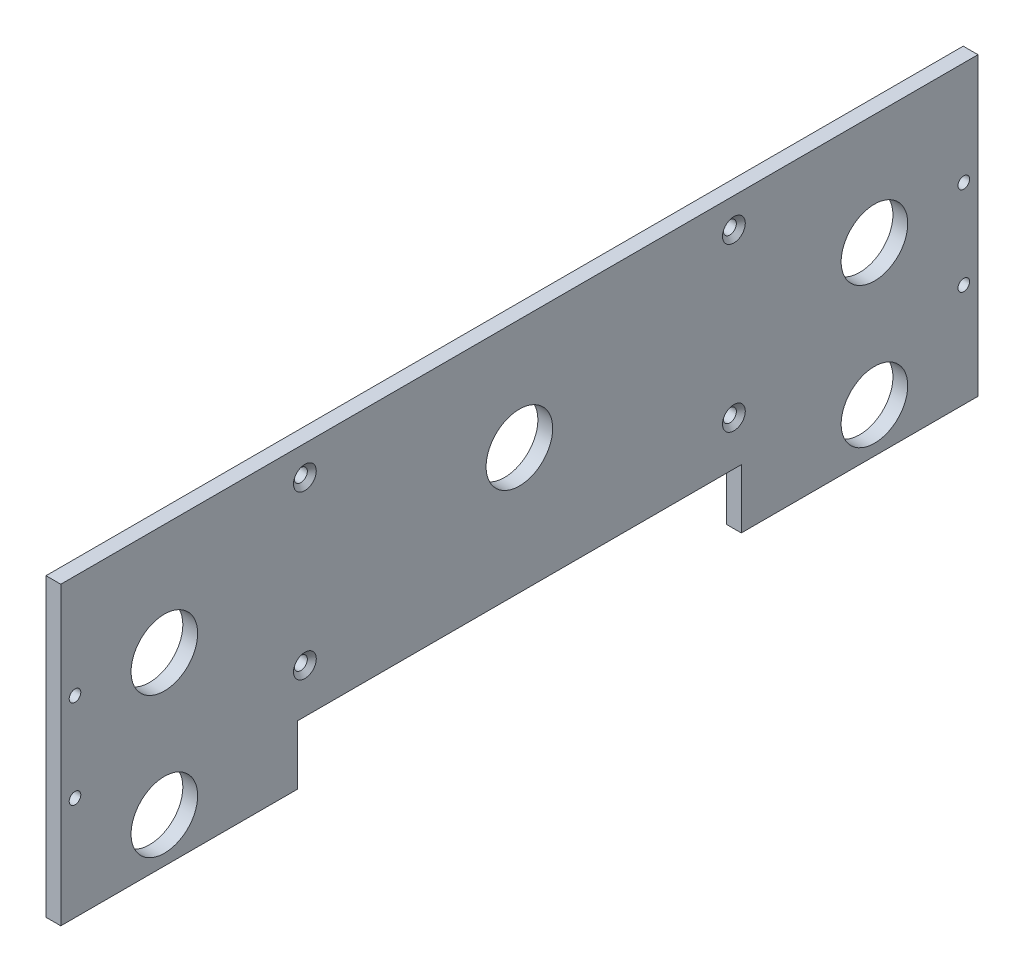
ISO-10303-21;
HEADER;
FILE_DESCRIPTION(('STEP AP214'),'2;1');
FILE_NAME('part.step','',(''),(''),'','','');
FILE_SCHEMA(('AUTOMOTIVE_DESIGN { 1 0 10303 214 1 1 1 1 }'));
ENDSEC;
DATA;
#1=APPLICATION_CONTEXT('core data for automotive mechanical design processes');
#2=APPLICATION_PROTOCOL_DEFINITION('international standard','automotive_design',2000,#1);
#3=PRODUCT_CONTEXT('',#1,'mechanical');
#4=PRODUCT('Part','Part','',(#3));
#5=PRODUCT_RELATED_PRODUCT_CATEGORY('part','',(#4));
#6=PRODUCT_DEFINITION_FORMATION('','',#4);
#7=PRODUCT_DEFINITION_CONTEXT('part definition',#1,'design');
#8=PRODUCT_DEFINITION('design','',#6,#7);
#9=PRODUCT_DEFINITION_SHAPE('','',#8);
#10=(LENGTH_UNIT() NAMED_UNIT(*) SI_UNIT(.MILLI.,.METRE.));
#11=(NAMED_UNIT(*) PLANE_ANGLE_UNIT() SI_UNIT($,.RADIAN.));
#12=(NAMED_UNIT(*) SI_UNIT($,.STERADIAN.) SOLID_ANGLE_UNIT());
#13=UNCERTAINTY_MEASURE_WITH_UNIT(LENGTH_MEASURE(1.E-05),#10,'distance_accuracy_value','');
#14=(GEOMETRIC_REPRESENTATION_CONTEXT(3) GLOBAL_UNCERTAINTY_ASSIGNED_CONTEXT((#13)) GLOBAL_UNIT_ASSIGNED_CONTEXT((#10,
#11,#12)) REPRESENTATION_CONTEXT('',''));
#15=CARTESIAN_POINT('',(0.,0.,0.));
#16=DIRECTION('',(0.,0.,1.));
#17=DIRECTION('',(1.,0.,0.));
#18=AXIS2_PLACEMENT_3D('',#15,#16,#17);
#19=CARTESIAN_POINT('',(6.35,-63.5,196.85));
#20=DIRECTION('',(0.,1.,0.));
#21=DIRECTION('',(0.,0.,1.));
#22=AXIS2_PLACEMENT_3D('',#19,#20,#21);
#23=PLANE('',#22);
#24=DIRECTION('',(0.,0.,-1.));
#25=VECTOR('',#24,1.);
#26=CARTESIAN_POINT('',(0.,-63.5,196.85));
#27=LINE('',#26,#25);
#28=CARTESIAN_POINT('',(0.,-63.5,196.85));
#29=VERTEX_POINT('',#28);
#30=CARTESIAN_POINT('',(0.,-63.5,95.25));
#31=VERTEX_POINT('',#30);
#32=EDGE_CURVE('E128',#29,#31,#27,.T.);
#33=ORIENTED_EDGE('',*,*,#32,.T.);
#34=DIRECTION('',(1.,0.,0.));
#35=VECTOR('',#34,1.);
#36=CARTESIAN_POINT('',(0.,-63.5,95.25));
#37=LINE('',#36,#35);
#38=CARTESIAN_POINT('',(6.35,-63.5,95.25));
#39=VERTEX_POINT('',#38);
#40=EDGE_CURVE('E155',#31,#39,#37,.T.);
#41=ORIENTED_EDGE('',*,*,#40,.T.);
#42=DIRECTION('',(0.,0.,-1.));
#43=VECTOR('',#42,1.);
#44=CARTESIAN_POINT('',(6.35,-63.5,196.85));
#45=LINE('',#44,#43);
#46=CARTESIAN_POINT('',(6.35,-63.5,196.85));
#47=VERTEX_POINT('',#46);
#48=EDGE_CURVE('E140',#47,#39,#45,.T.);
#49=ORIENTED_EDGE('',*,*,#48,.F.);
#50=DIRECTION('',(-1.,0.,0.));
#51=VECTOR('',#50,1.);
#52=CARTESIAN_POINT('',(6.35,-63.5,196.85));
#53=LINE('',#52,#51);
#54=EDGE_CURVE('E139',#47,#29,#53,.T.);
#55=ORIENTED_EDGE('',*,*,#54,.T.);
#56=EDGE_LOOP('',(#33,#41,#49,#55));
#57=FACE_BOUND('',#56,.T.);
#58=ADVANCED_FACE('F39',(#57),#23,.F.);
#59=CARTESIAN_POINT('',(6.35,63.5,-196.85));
#60=DIRECTION('',(0.,0.,1.));
#61=DIRECTION('',(1.,0.,0.));
#62=AXIS2_PLACEMENT_3D('',#59,#60,#61);
#63=PLANE('',#62);
#64=DIRECTION('',(0.,1.,0.));
#65=VECTOR('',#64,1.);
#66=CARTESIAN_POINT('',(0.,63.5,-196.85));
#67=LINE('',#66,#65);
#68=CARTESIAN_POINT('',(0.,-63.5,-196.85));
#69=VERTEX_POINT('',#68);
#70=CARTESIAN_POINT('',(0.,63.5,-196.85));
#71=VERTEX_POINT('',#70);
#72=EDGE_CURVE('E127',#69,#71,#67,.T.);
#73=ORIENTED_EDGE('',*,*,#72,.T.);
#74=DIRECTION('',(-1.,0.,0.));
#75=VECTOR('',#74,1.);
#76=CARTESIAN_POINT('',(6.35,63.5,-196.85));
#77=LINE('',#76,#75);
#78=CARTESIAN_POINT('',(6.35,63.5,-196.85));
#79=VERTEX_POINT('',#78);
#80=EDGE_CURVE('E11',#79,#71,#77,.T.);
#81=ORIENTED_EDGE('',*,*,#80,.F.);
#82=DIRECTION('',(0.,1.,0.));
#83=VECTOR('',#82,1.);
#84=CARTESIAN_POINT('',(6.35,63.5,-196.85));
#85=LINE('',#84,#83);
#86=CARTESIAN_POINT('',(6.35,-63.5,-196.85));
#87=VERTEX_POINT('',#86);
#88=EDGE_CURVE('E132',#87,#79,#85,.T.);
#89=ORIENTED_EDGE('',*,*,#88,.F.);
#90=DIRECTION('',(-1.,0.,0.));
#91=VECTOR('',#90,1.);
#92=CARTESIAN_POINT('',(6.35,-63.5,-196.85));
#93=LINE('',#92,#91);
#94=EDGE_CURVE('E137',#87,#69,#93,.T.);
#95=ORIENTED_EDGE('',*,*,#94,.T.);
#96=EDGE_LOOP('',(#73,#81,#89,#95));
#97=FACE_BOUND('',#96,.T.);
#98=ADVANCED_FACE('F41',(#97),#63,.F.);
#99=CARTESIAN_POINT('',(6.35,63.5,196.85));
#100=DIRECTION('',(0.,-1.,0.));
#101=DIRECTION('',(0.,0.,-1.));
#102=AXIS2_PLACEMENT_3D('',#99,#100,#101);
#103=PLANE('',#102);
#104=DIRECTION('',(0.,0.,1.));
#105=VECTOR('',#104,1.);
#106=CARTESIAN_POINT('',(0.,63.5,196.85));
#107=LINE('',#106,#105);
#108=CARTESIAN_POINT('',(0.,63.5,196.85));
#109=VERTEX_POINT('',#108);
#110=EDGE_CURVE('E133',#71,#109,#107,.T.);
#111=ORIENTED_EDGE('',*,*,#110,.T.);
#112=DIRECTION('',(-1.,0.,0.));
#113=VECTOR('',#112,1.);
#114=CARTESIAN_POINT('',(6.35,63.5,196.85));
#115=LINE('',#114,#113);
#116=CARTESIAN_POINT('',(6.35,63.5,196.85));
#117=VERTEX_POINT('',#116);
#118=EDGE_CURVE('E47',#117,#109,#115,.T.);
#119=ORIENTED_EDGE('',*,*,#118,.F.);
#120=DIRECTION('',(0.,0.,1.));
#121=VECTOR('',#120,1.);
#122=CARTESIAN_POINT('',(6.35,63.5,196.85));
#123=LINE('',#122,#121);
#124=EDGE_CURVE('E92',#79,#117,#123,.T.);
#125=ORIENTED_EDGE('',*,*,#124,.F.);
#126=ORIENTED_EDGE('',*,*,#80,.T.);
#127=EDGE_LOOP('',(#111,#119,#125,#126));
#128=FACE_BOUND('',#127,.T.);
#129=ADVANCED_FACE('F163',(#128),#103,.F.);
#130=CARTESIAN_POINT('',(6.35,63.5,196.85));
#131=DIRECTION('',(0.,0.,-1.));
#132=DIRECTION('',(-1.,0.,0.));
#133=AXIS2_PLACEMENT_3D('',#130,#131,#132);
#134=PLANE('',#133);
#135=DIRECTION('',(0.,-1.,0.));
#136=VECTOR('',#135,1.);
#137=CARTESIAN_POINT('',(0.,63.5,196.85));
#138=LINE('',#137,#136);
#139=EDGE_CURVE('E129',#109,#29,#138,.T.);
#140=ORIENTED_EDGE('',*,*,#139,.T.);
#141=ORIENTED_EDGE('',*,*,#54,.F.);
#142=DIRECTION('',(0.,-1.,0.));
#143=VECTOR('',#142,1.);
#144=CARTESIAN_POINT('',(6.35,63.5,196.85));
#145=LINE('',#144,#143);
#146=EDGE_CURVE('E148',#117,#47,#145,.T.);
#147=ORIENTED_EDGE('',*,*,#146,.F.);
#148=ORIENTED_EDGE('',*,*,#118,.T.);
#149=EDGE_LOOP('',(#140,#141,#147,#148));
#150=FACE_BOUND('',#149,.T.);
#151=ADVANCED_FACE('F146',(#150),#134,.F.);
#152=CARTESIAN_POINT('',(6.35,-63.5,-95.25));
#153=VERTEX_POINT('',#152);
#154=EDGE_CURVE('E63',#153,#87,#45,.T.);
#155=ORIENTED_EDGE('',*,*,#154,.F.);
#156=DIRECTION('',(1.,0.,0.));
#157=VECTOR('',#156,1.);
#158=CARTESIAN_POINT('',(0.,-63.5,-95.25));
#159=LINE('',#158,#157);
#160=CARTESIAN_POINT('',(0.,-63.5,-95.25));
#161=VERTEX_POINT('',#160);
#162=EDGE_CURVE('E116',#161,#153,#159,.T.);
#163=ORIENTED_EDGE('',*,*,#162,.F.);
#164=EDGE_CURVE('E85',#161,#69,#27,.T.);
#165=ORIENTED_EDGE('',*,*,#164,.T.);
#166=ORIENTED_EDGE('',*,*,#94,.F.);
#167=EDGE_LOOP('',(#155,#163,#165,#166));
#168=FACE_BOUND('',#167,.T.);
#169=ADVANCED_FACE('F121',(#168),#23,.F.);
#170=CARTESIAN_POINT('',(6.35,0.,0.));
#171=DIRECTION('',(1.,0.,0.));
#172=DIRECTION('',(0.,0.,-1.));
#173=AXIS2_PLACEMENT_3D('',#170,#171,#172);
#174=PLANE('',#173);
#175=DIRECTION('',(0.,-1.,0.));
#176=VECTOR('',#175,1.);
#177=CARTESIAN_POINT('',(6.35,-63.5,95.25));
#178=LINE('',#177,#176);
#179=CARTESIAN_POINT('',(6.35,-38.1,95.25));
#180=VERTEX_POINT('',#179);
#181=EDGE_CURVE('E119',#180,#39,#178,.T.);
#182=ORIENTED_EDGE('',*,*,#181,.F.);
#183=DIRECTION('',(0.,0.,1.));
#184=VECTOR('',#183,1.);
#185=CARTESIAN_POINT('',(6.35,-38.1,95.25));
#186=LINE('',#185,#184);
#187=CARTESIAN_POINT('',(6.35,-38.1,-95.25));
#188=VERTEX_POINT('',#187);
#189=EDGE_CURVE('E263',#188,#180,#186,.T.);
#190=ORIENTED_EDGE('',*,*,#189,.F.);
#191=DIRECTION('',(0.,1.,0.));
#192=VECTOR('',#191,1.);
#193=CARTESIAN_POINT('',(6.35,-38.1,-95.25));
#194=LINE('',#193,#192);
#195=EDGE_CURVE('E266',#153,#188,#194,.T.);
#196=ORIENTED_EDGE('',*,*,#195,.F.);
#197=ORIENTED_EDGE('',*,*,#154,.T.);
#198=ORIENTED_EDGE('',*,*,#88,.T.);
#199=ORIENTED_EDGE('',*,*,#124,.T.);
#200=ORIENTED_EDGE('',*,*,#146,.T.);
#201=ORIENTED_EDGE('',*,*,#48,.T.);
#202=EDGE_LOOP('',(#182,#190,#196,#197,#198,#199,#200,#201));
#203=FACE_BOUND('',#202,.T.);
#204=CARTESIAN_POINT('',(6.35,50.8,92.075));
#205=DIRECTION('',(1.,0.,0.));
#206=DIRECTION('',(0.,0.,-1.));
#207=AXIS2_PLACEMENT_3D('',#204,#205,#206);
#208=CIRCLE('',#207,4.8895);
#209=CARTESIAN_POINT('',(6.35,50.8,87.1855));
#210=VERTEX_POINT('',#209);
#211=EDGE_CURVE('E255',#210,#210,#208,.T.);
#212=ORIENTED_EDGE('',*,*,#211,.F.);
#213=EDGE_LOOP('',(#212));
#214=FACE_BOUND('',#213,.T.);
#215=CARTESIAN_POINT('',(6.35,50.8,-92.075));
#216=DIRECTION('',(1.,0.,0.));
#217=DIRECTION('',(0.,0.,-1.));
#218=AXIS2_PLACEMENT_3D('',#215,#216,#217);
#219=CIRCLE('',#218,4.8895);
#220=CARTESIAN_POINT('',(6.35,50.8,-96.9645));
#221=VERTEX_POINT('',#220);
#222=EDGE_CURVE('E246',#221,#221,#219,.T.);
#223=ORIENTED_EDGE('',*,*,#222,.F.);
#224=EDGE_LOOP('',(#223));
#225=FACE_BOUND('',#224,.T.);
#226=CARTESIAN_POINT('',(6.35,-19.05,92.075));
#227=DIRECTION('',(1.,0.,0.));
#228=DIRECTION('',(0.,0.,-1.));
#229=AXIS2_PLACEMENT_3D('',#226,#227,#228);
#230=CIRCLE('',#229,4.8895);
#231=CARTESIAN_POINT('',(6.35,-19.05,87.1855));
#232=VERTEX_POINT('',#231);
#233=EDGE_CURVE('E237',#232,#232,#230,.T.);
#234=ORIENTED_EDGE('',*,*,#233,.F.);
#235=EDGE_LOOP('',(#234));
#236=FACE_BOUND('',#235,.T.);
#237=CARTESIAN_POINT('',(6.35,-19.05,-92.075));
#238=DIRECTION('',(1.,0.,0.));
#239=DIRECTION('',(0.,0.,-1.));
#240=AXIS2_PLACEMENT_3D('',#237,#238,#239);
#241=CIRCLE('',#240,4.8895);
#242=CARTESIAN_POINT('',(6.35,-19.05,-96.9645));
#243=VERTEX_POINT('',#242);
#244=EDGE_CURVE('E228',#243,#243,#241,.T.);
#245=ORIENTED_EDGE('',*,*,#244,.F.);
#246=EDGE_LOOP('',(#245));
#247=FACE_BOUND('',#246,.T.);
#248=CARTESIAN_POINT('',(6.35,19.05,190.754));
#249=DIRECTION('',(1.,0.,0.));
#250=DIRECTION('',(0.,0.,-1.));
#251=AXIS2_PLACEMENT_3D('',#248,#249,#250);
#252=CIRCLE('',#251,2.4892);
#253=CARTESIAN_POINT('',(6.35,19.05,188.2648));
#254=VERTEX_POINT('',#253);
#255=EDGE_CURVE('E219',#254,#254,#252,.T.);
#256=ORIENTED_EDGE('',*,*,#255,.F.);
#257=EDGE_LOOP('',(#256));
#258=FACE_BOUND('',#257,.T.);
#259=CARTESIAN_POINT('',(6.35,-19.05,190.754));
#260=DIRECTION('',(1.,0.,0.));
#261=DIRECTION('',(0.,0.,-1.));
#262=AXIS2_PLACEMENT_3D('',#259,#260,#261);
#263=CIRCLE('',#262,2.4892);
#264=CARTESIAN_POINT('',(6.35,-19.05,188.2648));
#265=VERTEX_POINT('',#264);
#266=EDGE_CURVE('E213',#265,#265,#263,.T.);
#267=ORIENTED_EDGE('',*,*,#266,.F.);
#268=EDGE_LOOP('',(#267));
#269=FACE_BOUND('',#268,.T.);
#270=CARTESIAN_POINT('',(6.35,19.05,-190.754));
#271=DIRECTION('',(1.,0.,0.));
#272=DIRECTION('',(0.,0.,-1.));
#273=AXIS2_PLACEMENT_3D('',#270,#271,#272);
#274=CIRCLE('',#273,2.4892);
#275=CARTESIAN_POINT('',(6.35,19.05,-193.2432));
#276=VERTEX_POINT('',#275);
#277=EDGE_CURVE('E207',#276,#276,#274,.T.);
#278=ORIENTED_EDGE('',*,*,#277,.F.);
#279=EDGE_LOOP('',(#278));
#280=FACE_BOUND('',#279,.T.);
#281=CARTESIAN_POINT('',(6.35,-19.05,-190.754));
#282=DIRECTION('',(1.,0.,0.));
#283=DIRECTION('',(0.,0.,-1.));
#284=AXIS2_PLACEMENT_3D('',#281,#282,#283);
#285=CIRCLE('',#284,2.4892);
#286=CARTESIAN_POINT('',(6.35,-19.05,-193.2432));
#287=VERTEX_POINT('',#286);
#288=EDGE_CURVE('E201',#287,#287,#285,.T.);
#289=ORIENTED_EDGE('',*,*,#288,.F.);
#290=EDGE_LOOP('',(#289));
#291=FACE_BOUND('',#290,.T.);
#292=CARTESIAN_POINT('',(6.35,-44.45,-152.4));
#293=DIRECTION('',(1.,0.,0.));
#294=DIRECTION('',(0.,0.,-1.));
#295=AXIS2_PLACEMENT_3D('',#292,#293,#294);
#296=CIRCLE('',#295,14.2875);
#297=CARTESIAN_POINT('',(6.35,-44.45,-166.6875));
#298=VERTEX_POINT('',#297);
#299=EDGE_CURVE('E178',#298,#298,#296,.T.);
#300=ORIENTED_EDGE('',*,*,#299,.F.);
#301=EDGE_LOOP('',(#300));
#302=FACE_BOUND('',#301,.T.);
#303=CARTESIAN_POINT('',(6.35,-44.45,152.4));
#304=DIRECTION('',(1.,0.,0.));
#305=DIRECTION('',(0.,0.,-1.));
#306=AXIS2_PLACEMENT_3D('',#303,#304,#305);
#307=CIRCLE('',#306,14.2875);
#308=CARTESIAN_POINT('',(6.35,-44.45,138.1125));
#309=VERTEX_POINT('',#308);
#310=EDGE_CURVE('E185',#309,#309,#307,.T.);
#311=ORIENTED_EDGE('',*,*,#310,.F.);
#312=EDGE_LOOP('',(#311));
#313=FACE_BOUND('',#312,.T.);
#314=CARTESIAN_POINT('',(6.35,15.875,-152.4));
#315=DIRECTION('',(1.,0.,0.));
#316=DIRECTION('',(0.,0.,-1.));
#317=AXIS2_PLACEMENT_3D('',#314,#315,#316);
#318=CIRCLE('',#317,14.2875);
#319=CARTESIAN_POINT('',(6.35,15.875,-166.6875));
#320=VERTEX_POINT('',#319);
#321=EDGE_CURVE('E191',#320,#320,#318,.T.);
#322=ORIENTED_EDGE('',*,*,#321,.F.);
#323=EDGE_LOOP('',(#322));
#324=FACE_BOUND('',#323,.T.);
#325=CARTESIAN_POINT('',(6.35,15.875,152.4));
#326=DIRECTION('',(1.,0.,0.));
#327=DIRECTION('',(0.,0.,-1.));
#328=AXIS2_PLACEMENT_3D('',#325,#326,#327);
#329=CIRCLE('',#328,14.2875);
#330=CARTESIAN_POINT('',(6.35,15.875,138.1125));
#331=VERTEX_POINT('',#330);
#332=EDGE_CURVE('E172',#331,#331,#329,.T.);
#333=ORIENTED_EDGE('',*,*,#332,.F.);
#334=EDGE_LOOP('',(#333));
#335=FACE_BOUND('',#334,.T.);
#336=CARTESIAN_POINT('',(6.35,15.875,0.));
#337=DIRECTION('',(1.,0.,0.));
#338=DIRECTION('',(0.,0.,-1.));
#339=AXIS2_PLACEMENT_3D('',#336,#337,#338);
#340=CIRCLE('',#339,14.2875);
#341=CARTESIAN_POINT('',(6.35,15.875,-14.2875));
#342=VERTEX_POINT('',#341);
#343=EDGE_CURVE('E169',#342,#342,#340,.T.);
#344=ORIENTED_EDGE('',*,*,#343,.F.);
#345=EDGE_LOOP('',(#344));
#346=FACE_BOUND('',#345,.T.);
#347=ADVANCED_FACE('F270',(#203,#214,#225,#236,#247,#258,#269,#280,#291,#302,#313,#324,#335,
#346),#174,.T.);
#348=CARTESIAN_POINT('',(0.,0.,0.));
#349=DIRECTION('',(1.,0.,0.));
#350=DIRECTION('',(0.,0.,-1.));
#351=AXIS2_PLACEMENT_3D('',#348,#349,#350);
#352=PLANE('',#351);
#353=CARTESIAN_POINT('',(0.,50.8,92.075));
#354=DIRECTION('',(1.,0.,0.));
#355=DIRECTION('',(0.,0.,-1.));
#356=AXIS2_PLACEMENT_3D('',#353,#354,#355);
#357=CIRCLE('',#356,2.8067);
#358=CARTESIAN_POINT('',(0.,50.8,89.2683));
#359=VERTEX_POINT('',#358);
#360=EDGE_CURVE('E249',#359,#359,#357,.T.);
#361=ORIENTED_EDGE('',*,*,#360,.T.);
#362=EDGE_LOOP('',(#361));
#363=FACE_BOUND('',#362,.T.);
#364=CARTESIAN_POINT('',(0.,50.8,-92.075));
#365=DIRECTION('',(1.,0.,0.));
#366=DIRECTION('',(0.,0.,-1.));
#367=AXIS2_PLACEMENT_3D('',#364,#365,#366);
#368=CIRCLE('',#367,2.8067);
#369=CARTESIAN_POINT('',(0.,50.8,-94.8817));
#370=VERTEX_POINT('',#369);
#371=EDGE_CURVE('E240',#370,#370,#368,.T.);
#372=ORIENTED_EDGE('',*,*,#371,.T.);
#373=EDGE_LOOP('',(#372));
#374=FACE_BOUND('',#373,.T.);
#375=CARTESIAN_POINT('',(0.,-19.05,92.075));
#376=DIRECTION('',(1.,0.,0.));
#377=DIRECTION('',(0.,0.,-1.));
#378=AXIS2_PLACEMENT_3D('',#375,#376,#377);
#379=CIRCLE('',#378,2.8067);
#380=CARTESIAN_POINT('',(0.,-19.05,89.2683));
#381=VERTEX_POINT('',#380);
#382=EDGE_CURVE('E231',#381,#381,#379,.T.);
#383=ORIENTED_EDGE('',*,*,#382,.T.);
#384=EDGE_LOOP('',(#383));
#385=FACE_BOUND('',#384,.T.);
#386=CARTESIAN_POINT('',(0.,-19.05,-92.075));
#387=DIRECTION('',(1.,0.,0.));
#388=DIRECTION('',(0.,0.,-1.));
#389=AXIS2_PLACEMENT_3D('',#386,#387,#388);
#390=CIRCLE('',#389,2.8067);
#391=CARTESIAN_POINT('',(0.,-19.05,-94.8817));
#392=VERTEX_POINT('',#391);
#393=EDGE_CURVE('E222',#392,#392,#390,.T.);
#394=ORIENTED_EDGE('',*,*,#393,.T.);
#395=EDGE_LOOP('',(#394));
#396=FACE_BOUND('',#395,.T.);
#397=CARTESIAN_POINT('',(0.,19.05,190.754));
#398=DIRECTION('',(1.,0.,0.));
#399=DIRECTION('',(0.,0.,-1.));
#400=AXIS2_PLACEMENT_3D('',#397,#398,#399);
#401=CIRCLE('',#400,2.4892);
#402=CARTESIAN_POINT('',(0.,19.05,188.2648));
#403=VERTEX_POINT('',#402);
#404=EDGE_CURVE('E216',#403,#403,#401,.T.);
#405=ORIENTED_EDGE('',*,*,#404,.T.);
#406=EDGE_LOOP('',(#405));
#407=FACE_BOUND('',#406,.T.);
#408=CARTESIAN_POINT('',(0.,-19.05,190.754));
#409=DIRECTION('',(1.,0.,0.));
#410=DIRECTION('',(0.,0.,-1.));
#411=AXIS2_PLACEMENT_3D('',#408,#409,#410);
#412=CIRCLE('',#411,2.4892);
#413=CARTESIAN_POINT('',(0.,-19.05,188.2648));
#414=VERTEX_POINT('',#413);
#415=EDGE_CURVE('E210',#414,#414,#412,.T.);
#416=ORIENTED_EDGE('',*,*,#415,.T.);
#417=EDGE_LOOP('',(#416));
#418=FACE_BOUND('',#417,.T.);
#419=CARTESIAN_POINT('',(0.,19.05,-190.754));
#420=DIRECTION('',(1.,0.,0.));
#421=DIRECTION('',(0.,0.,-1.));
#422=AXIS2_PLACEMENT_3D('',#419,#420,#421);
#423=CIRCLE('',#422,2.4892);
#424=CARTESIAN_POINT('',(0.,19.05,-193.2432));
#425=VERTEX_POINT('',#424);
#426=EDGE_CURVE('E204',#425,#425,#423,.T.);
#427=ORIENTED_EDGE('',*,*,#426,.T.);
#428=EDGE_LOOP('',(#427));
#429=FACE_BOUND('',#428,.T.);
#430=CARTESIAN_POINT('',(0.,-19.05,-190.754));
#431=DIRECTION('',(1.,0.,0.));
#432=DIRECTION('',(0.,0.,-1.));
#433=AXIS2_PLACEMENT_3D('',#430,#431,#432);
#434=CIRCLE('',#433,2.4892);
#435=CARTESIAN_POINT('',(0.,-19.05,-193.2432));
#436=VERTEX_POINT('',#435);
#437=EDGE_CURVE('E179',#436,#436,#434,.T.);
#438=ORIENTED_EDGE('',*,*,#437,.T.);
#439=EDGE_LOOP('',(#438));
#440=FACE_BOUND('',#439,.T.);
#441=CARTESIAN_POINT('',(0.,-44.45,-152.4));
#442=DIRECTION('',(1.,0.,0.));
#443=DIRECTION('',(0.,0.,-1.));
#444=AXIS2_PLACEMENT_3D('',#441,#442,#443);
#445=CIRCLE('',#444,14.2875);
#446=CARTESIAN_POINT('',(0.,-44.45,-166.6875));
#447=VERTEX_POINT('',#446);
#448=EDGE_CURVE('E175',#447,#447,#445,.T.);
#449=ORIENTED_EDGE('',*,*,#448,.T.);
#450=EDGE_LOOP('',(#449));
#451=FACE_BOUND('',#450,.T.);
#452=CARTESIAN_POINT('',(0.,-44.45,152.4));
#453=DIRECTION('',(1.,0.,0.));
#454=DIRECTION('',(0.,0.,-1.));
#455=AXIS2_PLACEMENT_3D('',#452,#453,#454);
#456=CIRCLE('',#455,14.2875);
#457=CARTESIAN_POINT('',(0.,-44.45,138.1125));
#458=VERTEX_POINT('',#457);
#459=EDGE_CURVE('E182',#458,#458,#456,.T.);
#460=ORIENTED_EDGE('',*,*,#459,.T.);
#461=EDGE_LOOP('',(#460));
#462=FACE_BOUND('',#461,.T.);
#463=CARTESIAN_POINT('',(0.,15.875,-152.4));
#464=DIRECTION('',(1.,0.,0.));
#465=DIRECTION('',(0.,0.,-1.));
#466=AXIS2_PLACEMENT_3D('',#463,#464,#465);
#467=CIRCLE('',#466,14.2875);
#468=CARTESIAN_POINT('',(0.,15.875,-166.6875));
#469=VERTEX_POINT('',#468);
#470=EDGE_CURVE('E188',#469,#469,#467,.T.);
#471=ORIENTED_EDGE('',*,*,#470,.T.);
#472=EDGE_LOOP('',(#471));
#473=FACE_BOUND('',#472,.T.);
#474=CARTESIAN_POINT('',(0.,15.875,152.4));
#475=DIRECTION('',(1.,0.,0.));
#476=DIRECTION('',(0.,0.,-1.));
#477=AXIS2_PLACEMENT_3D('',#474,#475,#476);
#478=CIRCLE('',#477,14.2875);
#479=CARTESIAN_POINT('',(0.,15.875,138.1125));
#480=VERTEX_POINT('',#479);
#481=EDGE_CURVE('E194',#480,#480,#478,.T.);
#482=ORIENTED_EDGE('',*,*,#481,.T.);
#483=EDGE_LOOP('',(#482));
#484=FACE_BOUND('',#483,.T.);
#485=CARTESIAN_POINT('',(0.,15.875,0.));
#486=DIRECTION('',(1.,0.,0.));
#487=DIRECTION('',(0.,0.,-1.));
#488=AXIS2_PLACEMENT_3D('',#485,#486,#487);
#489=CIRCLE('',#488,14.2875);
#490=CARTESIAN_POINT('',(0.,15.875,-14.2875));
#491=VERTEX_POINT('',#490);
#492=EDGE_CURVE('E162',#491,#491,#489,.T.);
#493=ORIENTED_EDGE('',*,*,#492,.T.);
#494=EDGE_LOOP('',(#493));
#495=FACE_BOUND('',#494,.T.);
#496=DIRECTION('',(0.,0.,1.));
#497=VECTOR('',#496,1.);
#498=CARTESIAN_POINT('',(0.,-38.1,95.25));
#499=LINE('',#498,#497);
#500=CARTESIAN_POINT('',(0.,-38.1,-95.25));
#501=VERTEX_POINT('',#500);
#502=CARTESIAN_POINT('',(0.,-38.1,95.25));
#503=VERTEX_POINT('',#502);
#504=EDGE_CURVE('E54',#501,#503,#499,.T.);
#505=ORIENTED_EDGE('',*,*,#504,.T.);
#506=DIRECTION('',(0.,-1.,0.));
#507=VECTOR('',#506,1.);
#508=CARTESIAN_POINT('',(0.,-63.5,95.25));
#509=LINE('',#508,#507);
#510=EDGE_CURVE('E122',#503,#31,#509,.T.);
#511=ORIENTED_EDGE('',*,*,#510,.T.);
#512=ORIENTED_EDGE('',*,*,#32,.F.);
#513=ORIENTED_EDGE('',*,*,#139,.F.);
#514=ORIENTED_EDGE('',*,*,#110,.F.);
#515=ORIENTED_EDGE('',*,*,#72,.F.);
#516=ORIENTED_EDGE('',*,*,#164,.F.);
#517=DIRECTION('',(0.,1.,0.));
#518=VECTOR('',#517,1.);
#519=CARTESIAN_POINT('',(0.,-38.1,-95.25));
#520=LINE('',#519,#518);
#521=EDGE_CURVE('E113',#161,#501,#520,.T.);
#522=ORIENTED_EDGE('',*,*,#521,.T.);
#523=EDGE_LOOP('',(#505,#511,#512,#513,#514,#515,#516,#522));
#524=FACE_BOUND('',#523,.T.);
#525=ADVANCED_FACE('F125',(#363,#374,#385,#396,#407,#418,#429,#440,#451,#462,#473,#484,#495,
#524),#352,.F.);
#526=CARTESIAN_POINT('',(0.,15.875,0.));
#527=DIRECTION('',(1.,0.,0.));
#528=DIRECTION('',(0.,0.,-1.));
#529=AXIS2_PLACEMENT_3D('',#526,#527,#528);
#530=CYLINDRICAL_SURFACE('',#529,14.2875);
#531=ORIENTED_EDGE('',*,*,#492,.F.);
#532=EDGE_LOOP('',(#531));
#533=FACE_BOUND('',#532,.T.);
#534=ORIENTED_EDGE('',*,*,#343,.T.);
#535=EDGE_LOOP('',(#534));
#536=FACE_BOUND('',#535,.T.);
#537=ADVANCED_FACE('F345',(#533,#536),#530,.F.);
#538=CARTESIAN_POINT('',(0.,15.875,152.4));
#539=DIRECTION('',(1.,0.,0.));
#540=DIRECTION('',(0.,0.,-1.));
#541=AXIS2_PLACEMENT_3D('',#538,#539,#540);
#542=CYLINDRICAL_SURFACE('',#541,14.2875);
#543=ORIENTED_EDGE('',*,*,#481,.F.);
#544=EDGE_LOOP('',(#543));
#545=FACE_BOUND('',#544,.T.);
#546=ORIENTED_EDGE('',*,*,#332,.T.);
#547=EDGE_LOOP('',(#546));
#548=FACE_BOUND('',#547,.T.);
#549=ADVANCED_FACE('F354',(#545,#548),#542,.F.);
#550=CARTESIAN_POINT('',(0.,15.875,-152.4));
#551=DIRECTION('',(1.,0.,0.));
#552=DIRECTION('',(0.,0.,-1.));
#553=AXIS2_PLACEMENT_3D('',#550,#551,#552);
#554=CYLINDRICAL_SURFACE('',#553,14.2875);
#555=ORIENTED_EDGE('',*,*,#470,.F.);
#556=EDGE_LOOP('',(#555));
#557=FACE_BOUND('',#556,.T.);
#558=ORIENTED_EDGE('',*,*,#321,.T.);
#559=EDGE_LOOP('',(#558));
#560=FACE_BOUND('',#559,.T.);
#561=ADVANCED_FACE('F365',(#557,#560),#554,.F.);
#562=CARTESIAN_POINT('',(0.,-44.45,152.4));
#563=DIRECTION('',(1.,0.,0.));
#564=DIRECTION('',(0.,0.,-1.));
#565=AXIS2_PLACEMENT_3D('',#562,#563,#564);
#566=CYLINDRICAL_SURFACE('',#565,14.2875);
#567=ORIENTED_EDGE('',*,*,#459,.F.);
#568=EDGE_LOOP('',(#567));
#569=FACE_BOUND('',#568,.T.);
#570=ORIENTED_EDGE('',*,*,#310,.T.);
#571=EDGE_LOOP('',(#570));
#572=FACE_BOUND('',#571,.T.);
#573=ADVANCED_FACE('F376',(#569,#572),#566,.F.);
#574=CARTESIAN_POINT('',(0.,-44.45,-152.4));
#575=DIRECTION('',(1.,0.,0.));
#576=DIRECTION('',(0.,0.,-1.));
#577=AXIS2_PLACEMENT_3D('',#574,#575,#576);
#578=CYLINDRICAL_SURFACE('',#577,14.2875);
#579=ORIENTED_EDGE('',*,*,#448,.F.);
#580=EDGE_LOOP('',(#579));
#581=FACE_BOUND('',#580,.T.);
#582=ORIENTED_EDGE('',*,*,#299,.T.);
#583=EDGE_LOOP('',(#582));
#584=FACE_BOUND('',#583,.T.);
#585=ADVANCED_FACE('F387',(#581,#584),#578,.F.);
#586=CARTESIAN_POINT('',(6.35,-19.05,-190.754));
#587=DIRECTION('',(1.,0.,0.));
#588=DIRECTION('',(0.,0.,-1.));
#589=AXIS2_PLACEMENT_3D('',#586,#587,#588);
#590=CYLINDRICAL_SURFACE('',#589,2.4892);
#591=ORIENTED_EDGE('',*,*,#437,.F.);
#592=EDGE_LOOP('',(#591));
#593=FACE_BOUND('',#592,.T.);
#594=ORIENTED_EDGE('',*,*,#288,.T.);
#595=EDGE_LOOP('',(#594));
#596=FACE_BOUND('',#595,.T.);
#597=ADVANCED_FACE('F398',(#593,#596),#590,.F.);
#598=CARTESIAN_POINT('',(6.35,19.05,-190.754));
#599=DIRECTION('',(1.,0.,0.));
#600=DIRECTION('',(0.,0.,-1.));
#601=AXIS2_PLACEMENT_3D('',#598,#599,#600);
#602=CYLINDRICAL_SURFACE('',#601,2.4892);
#603=ORIENTED_EDGE('',*,*,#426,.F.);
#604=EDGE_LOOP('',(#603));
#605=FACE_BOUND('',#604,.T.);
#606=ORIENTED_EDGE('',*,*,#277,.T.);
#607=EDGE_LOOP('',(#606));
#608=FACE_BOUND('',#607,.T.);
#609=ADVANCED_FACE('F409',(#605,#608),#602,.F.);
#610=CARTESIAN_POINT('',(6.35,-19.05,190.754));
#611=DIRECTION('',(1.,0.,0.));
#612=DIRECTION('',(0.,0.,-1.));
#613=AXIS2_PLACEMENT_3D('',#610,#611,#612);
#614=CYLINDRICAL_SURFACE('',#613,2.4892);
#615=ORIENTED_EDGE('',*,*,#415,.F.);
#616=EDGE_LOOP('',(#615));
#617=FACE_BOUND('',#616,.T.);
#618=ORIENTED_EDGE('',*,*,#266,.T.);
#619=EDGE_LOOP('',(#618));
#620=FACE_BOUND('',#619,.T.);
#621=ADVANCED_FACE('F420',(#617,#620),#614,.F.);
#622=CARTESIAN_POINT('',(6.35,19.05,190.754));
#623=DIRECTION('',(1.,0.,0.));
#624=DIRECTION('',(0.,0.,-1.));
#625=AXIS2_PLACEMENT_3D('',#622,#623,#624);
#626=CYLINDRICAL_SURFACE('',#625,2.4892);
#627=ORIENTED_EDGE('',*,*,#404,.F.);
#628=EDGE_LOOP('',(#627));
#629=FACE_BOUND('',#628,.T.);
#630=ORIENTED_EDGE('',*,*,#255,.T.);
#631=EDGE_LOOP('',(#630));
#632=FACE_BOUND('',#631,.T.);
#633=ADVANCED_FACE('F431',(#629,#632),#626,.F.);
#634=CARTESIAN_POINT('',(6.35,-19.05,-92.075));
#635=DIRECTION('',(1.,0.,0.));
#636=DIRECTION('',(0.,0.,-1.));
#637=AXIS2_PLACEMENT_3D('',#634,#635,#636);
#638=CYLINDRICAL_SURFACE('',#637,2.8067);
#639=ORIENTED_EDGE('',*,*,#393,.F.);
#640=EDGE_LOOP('',(#639));
#641=FACE_BOUND('',#640,.T.);
#642=CARTESIAN_POINT('',(4.60232328818396,-19.05,-92.075));
#643=DIRECTION('',(1.,0.,0.));
#644=DIRECTION('',(0.,0.,-1.));
#645=AXIS2_PLACEMENT_3D('',#642,#643,#644);
#646=CIRCLE('',#645,2.8067);
#647=CARTESIAN_POINT('',(4.60232328818396,-19.05,-94.8817));
#648=VERTEX_POINT('',#647);
#649=EDGE_CURVE('E225',#648,#648,#646,.T.);
#650=ORIENTED_EDGE('',*,*,#649,.T.);
#651=EDGE_LOOP('',(#650));
#652=FACE_BOUND('',#651,.T.);
#653=ADVANCED_FACE('F442',(#641,#652),#638,.F.);
#654=CARTESIAN_POINT('',(6.35,-19.05,-92.075));
#655=DIRECTION('',(1.,0.,0.));
#656=DIRECTION('',(0.,0.,-1.));
#657=AXIS2_PLACEMENT_3D('',#654,#655,#656);
#658=CONICAL_SURFACE('',#657,4.8895,0.872664625997164);
#659=ORIENTED_EDGE('',*,*,#649,.F.);
#660=EDGE_LOOP('',(#659));
#661=FACE_BOUND('',#660,.T.);
#662=ORIENTED_EDGE('',*,*,#244,.T.);
#663=EDGE_LOOP('',(#662));
#664=FACE_BOUND('',#663,.T.);
#665=ADVANCED_FACE('F453',(#661,#664),#658,.F.);
#666=CARTESIAN_POINT('',(6.35,-19.05,92.075));
#667=DIRECTION('',(1.,0.,0.));
#668=DIRECTION('',(0.,0.,-1.));
#669=AXIS2_PLACEMENT_3D('',#666,#667,#668);
#670=CYLINDRICAL_SURFACE('',#669,2.8067);
#671=ORIENTED_EDGE('',*,*,#382,.F.);
#672=EDGE_LOOP('',(#671));
#673=FACE_BOUND('',#672,.T.);
#674=CARTESIAN_POINT('',(4.60232328818396,-19.05,92.075));
#675=DIRECTION('',(1.,0.,0.));
#676=DIRECTION('',(0.,0.,-1.));
#677=AXIS2_PLACEMENT_3D('',#674,#675,#676);
#678=CIRCLE('',#677,2.8067);
#679=CARTESIAN_POINT('',(4.60232328818396,-19.05,89.2683));
#680=VERTEX_POINT('',#679);
#681=EDGE_CURVE('E234',#680,#680,#678,.T.);
#682=ORIENTED_EDGE('',*,*,#681,.T.);
#683=EDGE_LOOP('',(#682));
#684=FACE_BOUND('',#683,.T.);
#685=ADVANCED_FACE('F464',(#673,#684),#670,.F.);
#686=CARTESIAN_POINT('',(6.35,-19.05,92.075));
#687=DIRECTION('',(1.,0.,0.));
#688=DIRECTION('',(0.,0.,-1.));
#689=AXIS2_PLACEMENT_3D('',#686,#687,#688);
#690=CONICAL_SURFACE('',#689,4.8895,0.872664625997164);
#691=ORIENTED_EDGE('',*,*,#681,.F.);
#692=EDGE_LOOP('',(#691));
#693=FACE_BOUND('',#692,.T.);
#694=ORIENTED_EDGE('',*,*,#233,.T.);
#695=EDGE_LOOP('',(#694));
#696=FACE_BOUND('',#695,.T.);
#697=ADVANCED_FACE('F475',(#693,#696),#690,.F.);
#698=CARTESIAN_POINT('',(6.35,50.8,-92.075));
#699=DIRECTION('',(1.,0.,0.));
#700=DIRECTION('',(0.,0.,-1.));
#701=AXIS2_PLACEMENT_3D('',#698,#699,#700);
#702=CYLINDRICAL_SURFACE('',#701,2.8067);
#703=ORIENTED_EDGE('',*,*,#371,.F.);
#704=EDGE_LOOP('',(#703));
#705=FACE_BOUND('',#704,.T.);
#706=CARTESIAN_POINT('',(4.60232328818396,50.8,-92.075));
#707=DIRECTION('',(1.,0.,0.));
#708=DIRECTION('',(0.,0.,-1.));
#709=AXIS2_PLACEMENT_3D('',#706,#707,#708);
#710=CIRCLE('',#709,2.8067);
#711=CARTESIAN_POINT('',(4.60232328818396,50.8,-94.8817));
#712=VERTEX_POINT('',#711);
#713=EDGE_CURVE('E243',#712,#712,#710,.T.);
#714=ORIENTED_EDGE('',*,*,#713,.T.);
#715=EDGE_LOOP('',(#714));
#716=FACE_BOUND('',#715,.T.);
#717=ADVANCED_FACE('F486',(#705,#716),#702,.F.);
#718=CARTESIAN_POINT('',(6.35,50.8,-92.075));
#719=DIRECTION('',(1.,0.,0.));
#720=DIRECTION('',(0.,0.,-1.));
#721=AXIS2_PLACEMENT_3D('',#718,#719,#720);
#722=CONICAL_SURFACE('',#721,4.8895,0.872664625997163);
#723=ORIENTED_EDGE('',*,*,#713,.F.);
#724=EDGE_LOOP('',(#723));
#725=FACE_BOUND('',#724,.T.);
#726=ORIENTED_EDGE('',*,*,#222,.T.);
#727=EDGE_LOOP('',(#726));
#728=FACE_BOUND('',#727,.T.);
#729=ADVANCED_FACE('F497',(#725,#728),#722,.F.);
#730=CARTESIAN_POINT('',(6.35,50.8,92.075));
#731=DIRECTION('',(1.,0.,0.));
#732=DIRECTION('',(0.,0.,-1.));
#733=AXIS2_PLACEMENT_3D('',#730,#731,#732);
#734=CYLINDRICAL_SURFACE('',#733,2.8067);
#735=ORIENTED_EDGE('',*,*,#360,.F.);
#736=EDGE_LOOP('',(#735));
#737=FACE_BOUND('',#736,.T.);
#738=CARTESIAN_POINT('',(4.60232328818396,50.8,92.075));
#739=DIRECTION('',(1.,0.,0.));
#740=DIRECTION('',(0.,0.,-1.));
#741=AXIS2_PLACEMENT_3D('',#738,#739,#740);
#742=CIRCLE('',#741,2.8067);
#743=CARTESIAN_POINT('',(4.60232328818396,50.8,89.2683));
#744=VERTEX_POINT('',#743);
#745=EDGE_CURVE('E252',#744,#744,#742,.T.);
#746=ORIENTED_EDGE('',*,*,#745,.T.);
#747=EDGE_LOOP('',(#746));
#748=FACE_BOUND('',#747,.T.);
#749=ADVANCED_FACE('F283',(#737,#748),#734,.F.);
#750=CARTESIAN_POINT('',(6.35,50.8,92.075));
#751=DIRECTION('',(1.,0.,0.));
#752=DIRECTION('',(0.,0.,-1.));
#753=AXIS2_PLACEMENT_3D('',#750,#751,#752);
#754=CONICAL_SURFACE('',#753,4.8895,0.872664625997163);
#755=ORIENTED_EDGE('',*,*,#745,.F.);
#756=EDGE_LOOP('',(#755));
#757=FACE_BOUND('',#756,.T.);
#758=ORIENTED_EDGE('',*,*,#211,.T.);
#759=EDGE_LOOP('',(#758));
#760=FACE_BOUND('',#759,.T.);
#761=ADVANCED_FACE('F276',(#757,#760),#754,.F.);
#762=CARTESIAN_POINT('',(0.,-63.5,95.25));
#763=DIRECTION('',(0.,0.,1.));
#764=DIRECTION('',(1.,0.,0.));
#765=AXIS2_PLACEMENT_3D('',#762,#763,#764);
#766=PLANE('',#765);
#767=ORIENTED_EDGE('',*,*,#181,.T.);
#768=ORIENTED_EDGE('',*,*,#40,.F.);
#769=ORIENTED_EDGE('',*,*,#510,.F.);
#770=DIRECTION('',(1.,0.,0.));
#771=VECTOR('',#770,1.);
#772=CARTESIAN_POINT('',(0.,-38.1,95.25));
#773=LINE('',#772,#771);
#774=EDGE_CURVE('E259',#503,#180,#773,.T.);
#775=ORIENTED_EDGE('',*,*,#774,.T.);
#776=EDGE_LOOP('',(#767,#768,#769,#775));
#777=FACE_BOUND('',#776,.T.);
#778=ADVANCED_FACE('F274',(#777),#766,.F.);
#779=CARTESIAN_POINT('',(0.,-38.1,95.25));
#780=DIRECTION('',(0.,1.,0.));
#781=DIRECTION('',(0.,0.,1.));
#782=AXIS2_PLACEMENT_3D('',#779,#780,#781);
#783=PLANE('',#782);
#784=ORIENTED_EDGE('',*,*,#189,.T.);
#785=ORIENTED_EDGE('',*,*,#774,.F.);
#786=ORIENTED_EDGE('',*,*,#504,.F.);
#787=DIRECTION('',(1.,0.,0.));
#788=VECTOR('',#787,1.);
#789=CARTESIAN_POINT('',(0.,-38.1,-95.25));
#790=LINE('',#789,#788);
#791=EDGE_CURVE('E117',#501,#188,#790,.T.);
#792=ORIENTED_EDGE('',*,*,#791,.T.);
#793=EDGE_LOOP('',(#784,#785,#786,#792));
#794=FACE_BOUND('',#793,.T.);
#795=ADVANCED_FACE('F272',(#794),#783,.F.);
#796=CARTESIAN_POINT('',(0.,-38.1,-95.25));
#797=DIRECTION('',(0.,0.,-1.));
#798=DIRECTION('',(0.,1.,0.));
#799=AXIS2_PLACEMENT_3D('',#796,#797,#798);
#800=PLANE('',#799);
#801=ORIENTED_EDGE('',*,*,#195,.T.);
#802=ORIENTED_EDGE('',*,*,#791,.F.);
#803=ORIENTED_EDGE('',*,*,#521,.F.);
#804=ORIENTED_EDGE('',*,*,#162,.T.);
#805=EDGE_LOOP('',(#801,#802,#803,#804));
#806=FACE_BOUND('',#805,.T.);
#807=ADVANCED_FACE('F115',(#806),#800,.F.);
#808=CLOSED_SHELL('',(#58,#98,#129,#151,#169,#347,#525,#537,#549,#561,#573,#585,#597,#609,#621,
#633,#653,#665,#685,#697,#717,#729,#749,#761,#778,#795,#807));
#809=MANIFOLD_SOLID_BREP('B2',#808);
#810=ADVANCED_BREP_SHAPE_REPRESENTATION('',(#18,#809),#14);
#811=SHAPE_DEFINITION_REPRESENTATION(#9,#810);
ENDSEC;
END-ISO-10303-21;
